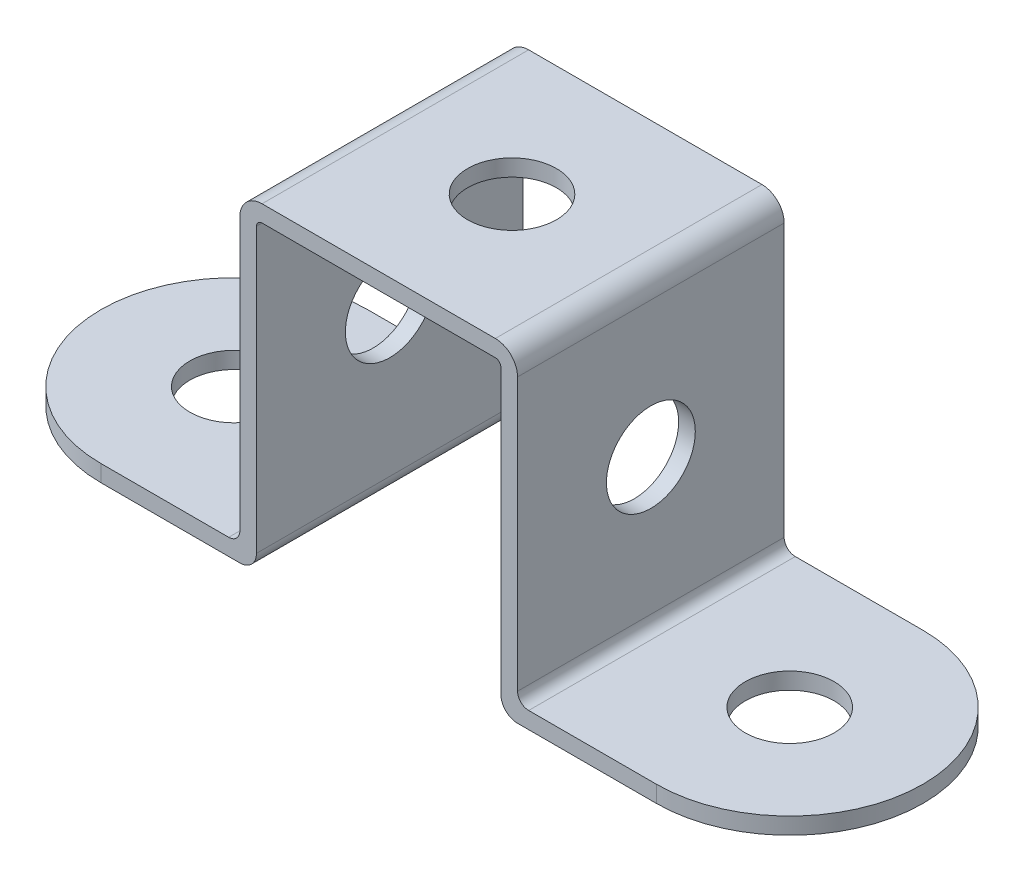
ISO-10303-21;
HEADER;
FILE_DESCRIPTION(('STEP AP214'),'2;1');
FILE_NAME('part.step','',(''),(''),'','','');
FILE_SCHEMA(('AUTOMOTIVE_DESIGN { 1 0 10303 214 1 1 1 1 }'));
ENDSEC;
DATA;
#1=APPLICATION_CONTEXT('core data for automotive mechanical design processes');
#2=APPLICATION_PROTOCOL_DEFINITION('international standard','automotive_design',2000,#1);
#3=PRODUCT_CONTEXT('',#1,'mechanical');
#4=PRODUCT('Part','Part','',(#3));
#5=PRODUCT_RELATED_PRODUCT_CATEGORY('part','',(#4));
#6=PRODUCT_DEFINITION_FORMATION('','',#4);
#7=PRODUCT_DEFINITION_CONTEXT('part definition',#1,'design');
#8=PRODUCT_DEFINITION('design','',#6,#7);
#9=PRODUCT_DEFINITION_SHAPE('','',#8);
#10=(LENGTH_UNIT() NAMED_UNIT(*) SI_UNIT(.MILLI.,.METRE.));
#11=(NAMED_UNIT(*) PLANE_ANGLE_UNIT() SI_UNIT($,.RADIAN.));
#12=(NAMED_UNIT(*) SI_UNIT($,.STERADIAN.) SOLID_ANGLE_UNIT());
#13=UNCERTAINTY_MEASURE_WITH_UNIT(LENGTH_MEASURE(1.E-05),#10,'distance_accuracy_value','');
#14=(GEOMETRIC_REPRESENTATION_CONTEXT(3) GLOBAL_UNCERTAINTY_ASSIGNED_CONTEXT((#13)) GLOBAL_UNIT_ASSIGNED_CONTEXT((#10,
#11,#12)) REPRESENTATION_CONTEXT('',''));
#15=CARTESIAN_POINT('',(0.,0.,0.));
#16=DIRECTION('',(0.,0.,1.));
#17=DIRECTION('',(1.,0.,0.));
#18=AXIS2_PLACEMENT_3D('',#15,#16,#17);
#19=CARTESIAN_POINT('',(0.,0.75,6.));
#20=DIRECTION('',(0.,-1.,0.));
#21=DIRECTION('',(1.,0.,0.));
#22=AXIS2_PLACEMENT_3D('',#19,#20,#21);
#23=PLANE('',#22);
#24=DIRECTION('',(-1.,0.,0.));
#25=VECTOR('',#24,1.);
#26=CARTESIAN_POINT('',(0.,0.75,-6.));
#27=LINE('',#26,#25);
#28=CARTESIAN_POINT('',(-1.25,0.75,-6.));
#29=VERTEX_POINT('',#28);
#30=CARTESIAN_POINT('',(-7.,0.749999999999999,-6.));
#31=VERTEX_POINT('',#30);
#32=EDGE_CURVE('E371',#29,#31,#27,.T.);
#33=ORIENTED_EDGE('',*,*,#32,.T.);
#34=CARTESIAN_POINT('',(-7.,0.749999999999999,0.));
#35=DIRECTION('',(0.,1.,0.));
#36=DIRECTION('',(-1.,0.,0.));
#37=AXIS2_PLACEMENT_3D('',#34,#35,#36);
#38=CIRCLE('',#37,6.);
#39=CARTESIAN_POINT('',(-7.,0.749999999999999,6.));
#40=VERTEX_POINT('',#39);
#41=EDGE_CURVE('E348',#31,#40,#38,.T.);
#42=ORIENTED_EDGE('',*,*,#41,.T.);
#43=DIRECTION('',(-1.,0.,0.));
#44=VECTOR('',#43,1.);
#45=CARTESIAN_POINT('',(0.,0.75,6.));
#46=LINE('',#45,#44);
#47=CARTESIAN_POINT('',(-1.25,0.75,6.));
#48=VERTEX_POINT('',#47);
#49=EDGE_CURVE('E372',#48,#40,#46,.T.);
#50=ORIENTED_EDGE('',*,*,#49,.F.);
#51=DIRECTION('',(0.,0.,-1.));
#52=VECTOR('',#51,1.);
#53=CARTESIAN_POINT('',(-1.25,0.75,-6.));
#54=LINE('',#53,#52);
#55=EDGE_CURVE('E410',#48,#29,#54,.T.);
#56=ORIENTED_EDGE('',*,*,#55,.T.);
#57=EDGE_LOOP('',(#33,#42,#50,#56));
#58=FACE_BOUND('',#57,.T.);
#59=CARTESIAN_POINT('',(-7.,0.749999999999999,0.));
#60=DIRECTION('',(0.,1.,0.));
#61=DIRECTION('',(-1.,0.,0.));
#62=AXIS2_PLACEMENT_3D('',#59,#60,#61);
#63=CIRCLE('',#62,2.);
#64=CARTESIAN_POINT('',(-9.,0.749999999999999,0.));
#65=VERTEX_POINT('',#64);
#66=EDGE_CURVE('E352',#65,#65,#63,.T.);
#67=ORIENTED_EDGE('',*,*,#66,.F.);
#68=EDGE_LOOP('',(#67));
#69=FACE_BOUND('',#68,.T.);
#70=ADVANCED_FACE('F39',(#58,#69),#23,.F.);
#71=CARTESIAN_POINT('',(0.,0.,6.));
#72=DIRECTION('',(0.,-1.,0.));
#73=DIRECTION('',(1.,0.,0.));
#74=AXIS2_PLACEMENT_3D('',#71,#72,#73);
#75=PLANE('',#74);
#76=DIRECTION('',(-1.,0.,0.));
#77=VECTOR('',#76,1.);
#78=CARTESIAN_POINT('',(0.,0.,6.));
#79=LINE('',#78,#77);
#80=CARTESIAN_POINT('',(-0.75,0.,6.));
#81=VERTEX_POINT('',#80);
#82=CARTESIAN_POINT('',(-7.,0.,6.));
#83=VERTEX_POINT('',#82);
#84=EDGE_CURVE('E375',#81,#83,#79,.T.);
#85=ORIENTED_EDGE('',*,*,#84,.T.);
#86=CARTESIAN_POINT('',(-7.,0.,0.));
#87=DIRECTION('',(0.,-1.,0.));
#88=DIRECTION('',(1.,0.,0.));
#89=AXIS2_PLACEMENT_3D('',#86,#87,#88);
#90=CIRCLE('',#89,6.);
#91=CARTESIAN_POINT('',(-7.,0.,-6.));
#92=VERTEX_POINT('',#91);
#93=EDGE_CURVE('E347',#92,#83,#90,.F.);
#94=ORIENTED_EDGE('',*,*,#93,.F.);
#95=DIRECTION('',(-1.,0.,0.));
#96=VECTOR('',#95,1.);
#97=CARTESIAN_POINT('',(0.,0.,-6.));
#98=LINE('',#97,#96);
#99=CARTESIAN_POINT('',(-0.75,0.,-6.));
#100=VERTEX_POINT('',#99);
#101=EDGE_CURVE('E389',#100,#92,#98,.T.);
#102=ORIENTED_EDGE('',*,*,#101,.F.);
#103=DIRECTION('',(0.,0.,-1.));
#104=VECTOR('',#103,1.);
#105=CARTESIAN_POINT('',(-0.75,0.,6.));
#106=LINE('',#105,#104);
#107=EDGE_CURVE('E404',#100,#81,#106,.F.);
#108=ORIENTED_EDGE('',*,*,#107,.T.);
#109=EDGE_LOOP('',(#85,#94,#102,#108));
#110=FACE_BOUND('',#109,.T.);
#111=CARTESIAN_POINT('',(-7.,0.,0.));
#112=DIRECTION('',(0.,-1.,0.));
#113=DIRECTION('',(1.,0.,0.));
#114=AXIS2_PLACEMENT_3D('',#111,#112,#113);
#115=CIRCLE('',#114,2.);
#116=CARTESIAN_POINT('',(-5.,0.,0.));
#117=VERTEX_POINT('',#116);
#118=EDGE_CURVE('E367',#117,#117,#115,.F.);
#119=ORIENTED_EDGE('',*,*,#118,.T.);
#120=EDGE_LOOP('',(#119));
#121=FACE_BOUND('',#120,.T.);
#122=ADVANCED_FACE('F445',(#110,#121),#75,.T.);
#123=CARTESIAN_POINT('',(0.,13.,6.));
#124=DIRECTION('',(1.,0.,0.));
#125=DIRECTION('',(0.,0.,-1.));
#126=AXIS2_PLACEMENT_3D('',#123,#124,#125);
#127=PLANE('',#126);
#128=CARTESIAN_POINT('',(0.,7.375,0.));
#129=DIRECTION('',(1.,0.,0.));
#130=DIRECTION('',(0.,0.,-1.));
#131=AXIS2_PLACEMENT_3D('',#128,#129,#130);
#132=CIRCLE('',#131,2.);
#133=CARTESIAN_POINT('',(0.,7.375,-2.));
#134=VERTEX_POINT('',#133);
#135=EDGE_CURVE('E548',#134,#134,#132,.T.);
#136=ORIENTED_EDGE('',*,*,#135,.F.);
#137=EDGE_LOOP('',(#136));
#138=FACE_BOUND('',#137,.T.);
#139=DIRECTION('',(0.,0.,-1.));
#140=VECTOR('',#139,1.);
#141=CARTESIAN_POINT('',(0.,13.5,6.));
#142=LINE('',#141,#140);
#143=CARTESIAN_POINT('',(0.,13.5,6.));
#144=VERTEX_POINT('',#143);
#145=CARTESIAN_POINT('',(0.,13.5,-6.));
#146=VERTEX_POINT('',#145);
#147=EDGE_CURVE('E319',#144,#146,#142,.T.);
#148=ORIENTED_EDGE('',*,*,#147,.F.);
#149=DIRECTION('',(0.,-1.,0.));
#150=VECTOR('',#149,1.);
#151=CARTESIAN_POINT('',(0.,13.,6.));
#152=LINE('',#151,#150);
#153=CARTESIAN_POINT('',(0.,0.750000000000004,6.));
#154=VERTEX_POINT('',#153);
#155=EDGE_CURVE('E379',#144,#154,#152,.T.);
#156=ORIENTED_EDGE('',*,*,#155,.T.);
#157=DIRECTION('',(0.,0.,-1.));
#158=VECTOR('',#157,1.);
#159=CARTESIAN_POINT('',(0.,0.750000000000001,6.));
#160=LINE('',#159,#158);
#161=CARTESIAN_POINT('',(0.,0.750000000000004,-6.));
#162=VERTEX_POINT('',#161);
#163=EDGE_CURVE('E386',#154,#162,#160,.T.);
#164=ORIENTED_EDGE('',*,*,#163,.T.);
#165=DIRECTION('',(0.,-1.,0.));
#166=VECTOR('',#165,1.);
#167=CARTESIAN_POINT('',(0.,13.,-6.));
#168=LINE('',#167,#166);
#169=EDGE_CURVE('E392',#146,#162,#168,.T.);
#170=ORIENTED_EDGE('',*,*,#169,.F.);
#171=EDGE_LOOP('',(#148,#156,#164,#170));
#172=FACE_BOUND('',#171,.T.);
#173=ADVANCED_FACE('F451',(#138,#172),#127,.T.);
#174=CARTESIAN_POINT('',(-0.75,13.,6.));
#175=DIRECTION('',(1.,0.,0.));
#176=DIRECTION('',(0.,0.,-1.));
#177=AXIS2_PLACEMENT_3D('',#174,#175,#176);
#178=PLANE('',#177);
#179=CARTESIAN_POINT('',(-0.75,7.375,0.));
#180=DIRECTION('',(1.,0.,0.));
#181=DIRECTION('',(0.,0.,-1.));
#182=AXIS2_PLACEMENT_3D('',#179,#180,#181);
#183=CIRCLE('',#182,2.);
#184=CARTESIAN_POINT('',(-0.75,7.375,-2.));
#185=VERTEX_POINT('',#184);
#186=EDGE_CURVE('E542',#185,#185,#183,.T.);
#187=ORIENTED_EDGE('',*,*,#186,.T.);
#188=EDGE_LOOP('',(#187));
#189=FACE_BOUND('',#188,.T.);
#190=DIRECTION('',(0.,1.,0.));
#191=VECTOR('',#190,1.);
#192=CARTESIAN_POINT('',(-0.75,13.,-6.));
#193=LINE('',#192,#191);
#194=CARTESIAN_POINT('',(-0.750000000000001,13.5,-6.));
#195=VERTEX_POINT('',#194);
#196=CARTESIAN_POINT('',(-0.75,1.25,-6.));
#197=VERTEX_POINT('',#196);
#198=EDGE_CURVE('E376',#195,#197,#193,.F.);
#199=ORIENTED_EDGE('',*,*,#198,.T.);
#200=DIRECTION('',(0.,0.,-1.));
#201=VECTOR('',#200,1.);
#202=CARTESIAN_POINT('',(-0.75,1.25,6.));
#203=LINE('',#202,#201);
#204=CARTESIAN_POINT('',(-0.75,1.25,6.));
#205=VERTEX_POINT('',#204);
#206=EDGE_CURVE('E55',#197,#205,#203,.F.);
#207=ORIENTED_EDGE('',*,*,#206,.T.);
#208=DIRECTION('',(0.,1.,0.));
#209=VECTOR('',#208,1.);
#210=CARTESIAN_POINT('',(-0.75,13.,6.));
#211=LINE('',#210,#209);
#212=CARTESIAN_POINT('',(-0.750000000000001,13.5,6.));
#213=VERTEX_POINT('',#212);
#214=EDGE_CURVE('E383',#213,#205,#211,.F.);
#215=ORIENTED_EDGE('',*,*,#214,.F.);
#216=DIRECTION('',(0.,0.,-1.));
#217=VECTOR('',#216,1.);
#218=CARTESIAN_POINT('',(-0.750000000000001,13.5,6.));
#219=LINE('',#218,#217);
#220=EDGE_CURVE('E335',#213,#195,#219,.T.);
#221=ORIENTED_EDGE('',*,*,#220,.T.);
#222=EDGE_LOOP('',(#199,#207,#215,#221));
#223=FACE_BOUND('',#222,.T.);
#224=ADVANCED_FACE('F457',(#189,#223),#178,.F.);
#225=CARTESIAN_POINT('',(0.,0.,6.));
#226=DIRECTION('',(0.,0.,-1.));
#227=DIRECTION('',(-1.,0.,0.));
#228=AXIS2_PLACEMENT_3D('',#225,#226,#227);
#229=PLANE('',#228);
#230=ORIENTED_EDGE('',*,*,#49,.T.);
#231=DIRECTION('',(0.,1.,0.));
#232=VECTOR('',#231,1.);
#233=CARTESIAN_POINT('',(-7.,-14.9253350046155,6.));
#234=LINE('',#233,#232);
#235=EDGE_CURVE('E357',#83,#40,#234,.T.);
#236=ORIENTED_EDGE('',*,*,#235,.F.);
#237=ORIENTED_EDGE('',*,*,#84,.F.);
#238=CARTESIAN_POINT('',(-0.75,0.750000000000001,6.));
#239=DIRECTION('',(0.,0.,-1.));
#240=DIRECTION('',(-1.,0.,0.));
#241=AXIS2_PLACEMENT_3D('',#238,#239,#240);
#242=CIRCLE('',#241,0.75);
#243=EDGE_CURVE('E407',#81,#154,#242,.F.);
#244=ORIENTED_EDGE('',*,*,#243,.T.);
#245=ORIENTED_EDGE('',*,*,#155,.F.);
#246=CARTESIAN_POINT('',(0.25,13.5,6.));
#247=DIRECTION('',(0.,0.,-1.));
#248=DIRECTION('',(-1.,0.,0.));
#249=AXIS2_PLACEMENT_3D('',#246,#247,#248);
#250=CIRCLE('',#249,0.25);
#251=CARTESIAN_POINT('',(0.25,13.75,6.));
#252=VERTEX_POINT('',#251);
#253=EDGE_CURVE('E304',#144,#252,#250,.T.);
#254=ORIENTED_EDGE('',*,*,#253,.T.);
#255=DIRECTION('',(1.,0.,0.));
#256=VECTOR('',#255,1.);
#257=CARTESIAN_POINT('',(0.25,13.75,6.));
#258=LINE('',#257,#256);
#259=CARTESIAN_POINT('',(10.75,13.75,6.));
#260=VERTEX_POINT('',#259);
#261=EDGE_CURVE('E308',#252,#260,#258,.T.);
#262=ORIENTED_EDGE('',*,*,#261,.T.);
#263=CARTESIAN_POINT('',(10.75,13.5,6.));
#264=DIRECTION('',(0.,0.,1.));
#265=DIRECTION('',(1.,0.,0.));
#266=AXIS2_PLACEMENT_3D('',#263,#264,#265);
#267=CIRCLE('',#266,0.25);
#268=CARTESIAN_POINT('',(11.,13.5,6.));
#269=VERTEX_POINT('',#268);
#270=EDGE_CURVE('E274',#269,#260,#267,.T.);
#271=ORIENTED_EDGE('',*,*,#270,.F.);
#272=DIRECTION('',(0.,-1.,0.));
#273=VECTOR('',#272,1.);
#274=CARTESIAN_POINT('',(11.,13.,6.));
#275=LINE('',#274,#273);
#276=CARTESIAN_POINT('',(11.,0.750000000000004,6.));
#277=VERTEX_POINT('',#276);
#278=EDGE_CURVE('E241',#269,#277,#275,.T.);
#279=ORIENTED_EDGE('',*,*,#278,.T.);
#280=CARTESIAN_POINT('',(11.75,0.750000000000001,6.));
#281=DIRECTION('',(0.,0.,1.));
#282=DIRECTION('',(1.,0.,0.));
#283=AXIS2_PLACEMENT_3D('',#280,#281,#282);
#284=CIRCLE('',#283,0.75);
#285=CARTESIAN_POINT('',(11.75,0.,6.));
#286=VERTEX_POINT('',#285);
#287=EDGE_CURVE('E271',#286,#277,#284,.F.);
#288=ORIENTED_EDGE('',*,*,#287,.F.);
#289=DIRECTION('',(1.,0.,0.));
#290=VECTOR('',#289,1.);
#291=CARTESIAN_POINT('',(11.,0.,6.));
#292=LINE('',#291,#290);
#293=CARTESIAN_POINT('',(18.,0.,6.));
#294=VERTEX_POINT('',#293);
#295=EDGE_CURVE('E220',#286,#294,#292,.T.);
#296=ORIENTED_EDGE('',*,*,#295,.T.);
#297=DIRECTION('',(0.,1.,0.));
#298=VECTOR('',#297,1.);
#299=CARTESIAN_POINT('',(18.,-14.9253350046155,6.));
#300=LINE('',#299,#298);
#301=CARTESIAN_POINT('',(18.,0.749999999999999,6.));
#302=VERTEX_POINT('',#301);
#303=EDGE_CURVE('E268',#294,#302,#300,.T.);
#304=ORIENTED_EDGE('',*,*,#303,.T.);
#305=DIRECTION('',(1.,0.,0.));
#306=VECTOR('',#305,1.);
#307=CARTESIAN_POINT('',(11.,0.75,6.));
#308=LINE('',#307,#306);
#309=CARTESIAN_POINT('',(12.25,0.75,6.));
#310=VERTEX_POINT('',#309);
#311=EDGE_CURVE('E196',#310,#302,#308,.T.);
#312=ORIENTED_EDGE('',*,*,#311,.F.);
#313=CARTESIAN_POINT('',(12.25,1.25,6.));
#314=DIRECTION('',(0.,0.,1.));
#315=DIRECTION('',(1.,0.,0.));
#316=AXIS2_PLACEMENT_3D('',#313,#314,#315);
#317=CIRCLE('',#316,0.5);
#318=CARTESIAN_POINT('',(11.75,1.25,6.));
#319=VERTEX_POINT('',#318);
#320=EDGE_CURVE('E187',#319,#310,#317,.T.);
#321=ORIENTED_EDGE('',*,*,#320,.F.);
#322=DIRECTION('',(0.,1.,0.));
#323=VECTOR('',#322,1.);
#324=CARTESIAN_POINT('',(11.75,13.,6.));
#325=LINE('',#324,#323);
#326=CARTESIAN_POINT('',(11.75,13.5,6.));
#327=VERTEX_POINT('',#326);
#328=EDGE_CURVE('E260',#327,#319,#325,.F.);
#329=ORIENTED_EDGE('',*,*,#328,.F.);
#330=CARTESIAN_POINT('',(10.75,13.5,6.));
#331=DIRECTION('',(0.,0.,-1.));
#332=DIRECTION('',(-1.,0.,0.));
#333=AXIS2_PLACEMENT_3D('',#330,#331,#332);
#334=CIRCLE('',#333,1.);
#335=CARTESIAN_POINT('',(10.75,14.5,6.));
#336=VERTEX_POINT('',#335);
#337=EDGE_CURVE('E278',#336,#327,#334,.T.);
#338=ORIENTED_EDGE('',*,*,#337,.F.);
#339=DIRECTION('',(-1.,0.,0.));
#340=VECTOR('',#339,1.);
#341=CARTESIAN_POINT('',(0.25,14.5,6.));
#342=LINE('',#341,#340);
#343=CARTESIAN_POINT('',(0.25,14.5,6.));
#344=VERTEX_POINT('',#343);
#345=EDGE_CURVE('E312',#336,#344,#342,.T.);
#346=ORIENTED_EDGE('',*,*,#345,.T.);
#347=CARTESIAN_POINT('',(0.25,13.5,6.));
#348=DIRECTION('',(0.,0.,1.));
#349=DIRECTION('',(1.,0.,0.));
#350=AXIS2_PLACEMENT_3D('',#347,#348,#349);
#351=CIRCLE('',#350,1.);
#352=EDGE_CURVE('E315',#344,#213,#351,.T.);
#353=ORIENTED_EDGE('',*,*,#352,.T.);
#354=ORIENTED_EDGE('',*,*,#214,.T.);
#355=CARTESIAN_POINT('',(-1.25,1.25,6.));
#356=DIRECTION('',(0.,0.,-1.));
#357=DIRECTION('',(-1.,0.,0.));
#358=AXIS2_PLACEMENT_3D('',#355,#356,#357);
#359=CIRCLE('',#358,0.5);
#360=EDGE_CURVE('E11',#205,#48,#359,.T.);
#361=ORIENTED_EDGE('',*,*,#360,.T.);
#362=EDGE_LOOP('',(#230,#236,#237,#244,#245,#254,#262,#271,#279,#288,#296,#304,#312,#321,#329,
#338,#346,#353,#354,#361));
#363=FACE_BOUND('',#362,.T.);
#364=ADVANCED_FACE('F431',(#363),#229,.F.);
#365=CARTESIAN_POINT('',(0.,0.,-6.));
#366=DIRECTION('',(0.,0.,-1.));
#367=DIRECTION('',(-1.,0.,0.));
#368=AXIS2_PLACEMENT_3D('',#365,#366,#367);
#369=PLANE('',#368);
#370=ORIENTED_EDGE('',*,*,#101,.T.);
#371=DIRECTION('',(0.,1.,0.));
#372=VECTOR('',#371,1.);
#373=CARTESIAN_POINT('',(-7.,-14.9253350046155,-6.));
#374=LINE('',#373,#372);
#375=EDGE_CURVE('E353',#92,#31,#374,.T.);
#376=ORIENTED_EDGE('',*,*,#375,.T.);
#377=ORIENTED_EDGE('',*,*,#32,.F.);
#378=CARTESIAN_POINT('',(-1.25,1.25,-6.));
#379=DIRECTION('',(0.,0.,-1.));
#380=DIRECTION('',(-1.,0.,0.));
#381=AXIS2_PLACEMENT_3D('',#378,#379,#380);
#382=CIRCLE('',#381,0.5);
#383=EDGE_CURVE('E48',#29,#197,#382,.F.);
#384=ORIENTED_EDGE('',*,*,#383,.T.);
#385=ORIENTED_EDGE('',*,*,#198,.F.);
#386=CARTESIAN_POINT('',(0.25,13.5,-6.));
#387=DIRECTION('',(0.,0.,1.));
#388=DIRECTION('',(1.,0.,0.));
#389=AXIS2_PLACEMENT_3D('',#386,#387,#388);
#390=CIRCLE('',#389,1.);
#391=CARTESIAN_POINT('',(0.25,14.5,-6.));
#392=VERTEX_POINT('',#391);
#393=EDGE_CURVE('E309',#392,#195,#390,.T.);
#394=ORIENTED_EDGE('',*,*,#393,.F.);
#395=DIRECTION('',(-1.,0.,0.));
#396=VECTOR('',#395,1.);
#397=CARTESIAN_POINT('',(0.25,14.5,-6.));
#398=LINE('',#397,#396);
#399=CARTESIAN_POINT('',(10.75,14.5,-6.));
#400=VERTEX_POINT('',#399);
#401=EDGE_CURVE('E326',#400,#392,#398,.T.);
#402=ORIENTED_EDGE('',*,*,#401,.F.);
#403=CARTESIAN_POINT('',(10.75,13.5,-6.));
#404=DIRECTION('',(0.,0.,-1.));
#405=DIRECTION('',(-1.,0.,0.));
#406=AXIS2_PLACEMENT_3D('',#403,#404,#405);
#407=CIRCLE('',#406,1.);
#408=CARTESIAN_POINT('',(11.75,13.5,-6.));
#409=VERTEX_POINT('',#408);
#410=EDGE_CURVE('E285',#400,#409,#407,.T.);
#411=ORIENTED_EDGE('',*,*,#410,.T.);
#412=DIRECTION('',(0.,1.,0.));
#413=VECTOR('',#412,1.);
#414=CARTESIAN_POINT('',(11.75,13.,-6.));
#415=LINE('',#414,#413);
#416=CARTESIAN_POINT('',(11.75,1.25,-6.));
#417=VERTEX_POINT('',#416);
#418=EDGE_CURVE('E253',#409,#417,#415,.F.);
#419=ORIENTED_EDGE('',*,*,#418,.T.);
#420=CARTESIAN_POINT('',(12.25,1.25,-6.));
#421=DIRECTION('',(0.,0.,1.));
#422=DIRECTION('',(1.,0.,0.));
#423=AXIS2_PLACEMENT_3D('',#420,#421,#422);
#424=CIRCLE('',#423,0.5);
#425=CARTESIAN_POINT('',(12.25,0.75,-6.));
#426=VERTEX_POINT('',#425);
#427=EDGE_CURVE('E186',#426,#417,#424,.F.);
#428=ORIENTED_EDGE('',*,*,#427,.F.);
#429=DIRECTION('',(1.,0.,0.));
#430=VECTOR('',#429,1.);
#431=CARTESIAN_POINT('',(11.,0.75,-6.));
#432=LINE('',#431,#430);
#433=CARTESIAN_POINT('',(18.,0.749999999999999,-6.));
#434=VERTEX_POINT('',#433);
#435=EDGE_CURVE('E194',#426,#434,#432,.T.);
#436=ORIENTED_EDGE('',*,*,#435,.T.);
#437=DIRECTION('',(0.,1.,0.));
#438=VECTOR('',#437,1.);
#439=CARTESIAN_POINT('',(18.,-14.9253350046155,-6.));
#440=LINE('',#439,#438);
#441=CARTESIAN_POINT('',(18.,0.,-6.));
#442=VERTEX_POINT('',#441);
#443=EDGE_CURVE('E175',#442,#434,#440,.T.);
#444=ORIENTED_EDGE('',*,*,#443,.F.);
#445=DIRECTION('',(1.,0.,0.));
#446=VECTOR('',#445,1.);
#447=CARTESIAN_POINT('',(11.,0.,-6.));
#448=LINE('',#447,#446);
#449=CARTESIAN_POINT('',(11.75,0.,-6.));
#450=VERTEX_POINT('',#449);
#451=EDGE_CURVE('E226',#450,#442,#448,.T.);
#452=ORIENTED_EDGE('',*,*,#451,.F.);
#453=CARTESIAN_POINT('',(11.75,0.750000000000001,-6.));
#454=DIRECTION('',(0.,0.,1.));
#455=DIRECTION('',(1.,0.,0.));
#456=AXIS2_PLACEMENT_3D('',#453,#454,#455);
#457=CIRCLE('',#456,0.75);
#458=CARTESIAN_POINT('',(11.,0.750000000000004,-6.));
#459=VERTEX_POINT('',#458);
#460=EDGE_CURVE('E292',#459,#450,#457,.T.);
#461=ORIENTED_EDGE('',*,*,#460,.F.);
#462=DIRECTION('',(0.,-1.,0.));
#463=VECTOR('',#462,1.);
#464=CARTESIAN_POINT('',(11.,13.,-6.));
#465=LINE('',#464,#463);
#466=CARTESIAN_POINT('',(11.,13.5,-6.));
#467=VERTEX_POINT('',#466);
#468=EDGE_CURVE('E249',#467,#459,#465,.T.);
#469=ORIENTED_EDGE('',*,*,#468,.F.);
#470=CARTESIAN_POINT('',(10.75,13.5,-6.));
#471=DIRECTION('',(0.,0.,1.));
#472=DIRECTION('',(1.,0.,0.));
#473=AXIS2_PLACEMENT_3D('',#470,#471,#472);
#474=CIRCLE('',#473,0.25);
#475=CARTESIAN_POINT('',(10.75,13.75,-6.));
#476=VERTEX_POINT('',#475);
#477=EDGE_CURVE('E288',#467,#476,#474,.T.);
#478=ORIENTED_EDGE('',*,*,#477,.T.);
#479=DIRECTION('',(1.,0.,0.));
#480=VECTOR('',#479,1.);
#481=CARTESIAN_POINT('',(0.25,13.75,-6.));
#482=LINE('',#481,#480);
#483=CARTESIAN_POINT('',(0.25,13.75,-6.));
#484=VERTEX_POINT('',#483);
#485=EDGE_CURVE('E323',#484,#476,#482,.T.);
#486=ORIENTED_EDGE('',*,*,#485,.F.);
#487=CARTESIAN_POINT('',(0.25,13.5,-6.));
#488=DIRECTION('',(0.,0.,-1.));
#489=DIRECTION('',(-1.,0.,0.));
#490=AXIS2_PLACEMENT_3D('',#487,#488,#489);
#491=CIRCLE('',#490,0.25);
#492=EDGE_CURVE('E303',#146,#484,#491,.T.);
#493=ORIENTED_EDGE('',*,*,#492,.F.);
#494=ORIENTED_EDGE('',*,*,#169,.T.);
#495=CARTESIAN_POINT('',(-0.75,0.750000000000001,-6.));
#496=DIRECTION('',(0.,0.,-1.));
#497=DIRECTION('',(-1.,0.,0.));
#498=AXIS2_PLACEMENT_3D('',#495,#496,#497);
#499=CIRCLE('',#498,0.75);
#500=EDGE_CURVE('E401',#162,#100,#499,.T.);
#501=ORIENTED_EDGE('',*,*,#500,.T.);
#502=EDGE_LOOP('',(#370,#376,#377,#384,#385,#394,#402,#411,#419,#428,#436,#444,#452,#461,#469,
#478,#486,#493,#494,#501));
#503=FACE_BOUND('',#502,.T.);
#504=ADVANCED_FACE('F199',(#503),#369,.T.);
#505=CARTESIAN_POINT('',(-7.,-5.65685424949238,0.));
#506=DIRECTION('',(0.,1.,0.));
#507=DIRECTION('',(-1.,0.,0.));
#508=AXIS2_PLACEMENT_3D('',#505,#506,#507);
#509=CYLINDRICAL_SURFACE('',#508,2.);
#510=ORIENTED_EDGE('',*,*,#66,.T.);
#511=EDGE_LOOP('',(#510));
#512=FACE_BOUND('',#511,.T.);
#513=ORIENTED_EDGE('',*,*,#118,.F.);
#514=EDGE_LOOP('',(#513));
#515=FACE_BOUND('',#514,.T.);
#516=ADVANCED_FACE('F442',(#512,#515),#509,.F.);
#517=CARTESIAN_POINT('',(-0.75,0.750000000000001,6.));
#518=DIRECTION('',(0.,0.,-1.));
#519=DIRECTION('',(-1.,0.,0.));
#520=AXIS2_PLACEMENT_3D('',#517,#518,#519);
#521=CYLINDRICAL_SURFACE('',#520,0.75);
#522=ORIENTED_EDGE('',*,*,#243,.F.);
#523=ORIENTED_EDGE('',*,*,#107,.F.);
#524=ORIENTED_EDGE('',*,*,#500,.F.);
#525=ORIENTED_EDGE('',*,*,#163,.F.);
#526=EDGE_LOOP('',(#522,#523,#524,#525));
#527=FACE_BOUND('',#526,.T.);
#528=ADVANCED_FACE('F434',(#527),#521,.T.);
#529=CARTESIAN_POINT('',(-1.25,1.25,6.));
#530=DIRECTION('',(0.,0.,1.));
#531=DIRECTION('',(1.,0.,0.));
#532=AXIS2_PLACEMENT_3D('',#529,#530,#531);
#533=CYLINDRICAL_SURFACE('',#532,0.5);
#534=ORIENTED_EDGE('',*,*,#360,.F.);
#535=ORIENTED_EDGE('',*,*,#206,.F.);
#536=ORIENTED_EDGE('',*,*,#383,.F.);
#537=ORIENTED_EDGE('',*,*,#55,.F.);
#538=EDGE_LOOP('',(#534,#535,#536,#537));
#539=FACE_BOUND('',#538,.T.);
#540=ADVANCED_FACE('F41',(#539),#533,.F.);
#541=CARTESIAN_POINT('',(-7.,-14.9253350046155,0.));
#542=DIRECTION('',(0.,1.,0.));
#543=DIRECTION('',(-1.,0.,0.));
#544=AXIS2_PLACEMENT_3D('',#541,#542,#543);
#545=CYLINDRICAL_SURFACE('',#544,6.);
#546=ORIENTED_EDGE('',*,*,#375,.F.);
#547=ORIENTED_EDGE('',*,*,#93,.T.);
#548=ORIENTED_EDGE('',*,*,#235,.T.);
#549=ORIENTED_EDGE('',*,*,#41,.F.);
#550=EDGE_LOOP('',(#546,#547,#548,#549));
#551=FACE_BOUND('',#550,.T.);
#552=ADVANCED_FACE('F427',(#551),#545,.T.);
#553=CARTESIAN_POINT('',(0.25,13.5,6.));
#554=DIRECTION('',(0.,0.,-1.));
#555=DIRECTION('',(-1.,0.,0.));
#556=AXIS2_PLACEMENT_3D('',#553,#554,#555);
#557=CYLINDRICAL_SURFACE('',#556,0.25);
#558=ORIENTED_EDGE('',*,*,#492,.T.);
#559=DIRECTION('',(0.,0.,-1.));
#560=VECTOR('',#559,1.);
#561=CARTESIAN_POINT('',(0.25,13.75,6.));
#562=LINE('',#561,#560);
#563=EDGE_CURVE('E343',#252,#484,#562,.T.);
#564=ORIENTED_EDGE('',*,*,#563,.F.);
#565=ORIENTED_EDGE('',*,*,#253,.F.);
#566=ORIENTED_EDGE('',*,*,#147,.T.);
#567=EDGE_LOOP('',(#558,#564,#565,#566));
#568=FACE_BOUND('',#567,.T.);
#569=ADVANCED_FACE('F440',(#568),#557,.F.);
#570=CARTESIAN_POINT('',(0.25,13.75,6.));
#571=DIRECTION('',(0.,1.,0.));
#572=DIRECTION('',(0.,0.,1.));
#573=AXIS2_PLACEMENT_3D('',#570,#571,#572);
#574=PLANE('',#573);
#575=CARTESIAN_POINT('',(5.5,13.75,0.));
#576=DIRECTION('',(0.,1.,0.));
#577=DIRECTION('',(0.,0.,1.));
#578=AXIS2_PLACEMENT_3D('',#575,#576,#577);
#579=CIRCLE('',#578,2.);
#580=CARTESIAN_POINT('',(5.5,13.75,2.));
#581=VERTEX_POINT('',#580);
#582=EDGE_CURVE('E203',#581,#581,#579,.F.);
#583=ORIENTED_EDGE('',*,*,#582,.F.);
#584=EDGE_LOOP('',(#583));
#585=FACE_BOUND('',#584,.T.);
#586=ORIENTED_EDGE('',*,*,#485,.T.);
#587=DIRECTION('',(0.,0.,-1.));
#588=VECTOR('',#587,1.);
#589=CARTESIAN_POINT('',(10.75,13.75,6.));
#590=LINE('',#589,#588);
#591=EDGE_CURVE('E295',#260,#476,#590,.T.);
#592=ORIENTED_EDGE('',*,*,#591,.F.);
#593=ORIENTED_EDGE('',*,*,#261,.F.);
#594=ORIENTED_EDGE('',*,*,#563,.T.);
#595=EDGE_LOOP('',(#586,#592,#593,#594));
#596=FACE_BOUND('',#595,.T.);
#597=ADVANCED_FACE('F471',(#585,#596),#574,.F.);
#598=CARTESIAN_POINT('',(0.25,14.5,6.));
#599=DIRECTION('',(0.,-1.,0.));
#600=DIRECTION('',(0.,0.,-1.));
#601=AXIS2_PLACEMENT_3D('',#598,#599,#600);
#602=PLANE('',#601);
#603=CARTESIAN_POINT('',(5.5,14.5,0.));
#604=DIRECTION('',(0.,1.,0.));
#605=DIRECTION('',(0.,0.,1.));
#606=AXIS2_PLACEMENT_3D('',#603,#604,#605);
#607=CIRCLE('',#606,2.);
#608=CARTESIAN_POINT('',(5.5,14.5,2.));
#609=VERTEX_POINT('',#608);
#610=EDGE_CURVE('E207',#609,#609,#607,.T.);
#611=ORIENTED_EDGE('',*,*,#610,.F.);
#612=EDGE_LOOP('',(#611));
#613=FACE_BOUND('',#612,.T.);
#614=ORIENTED_EDGE('',*,*,#401,.T.);
#615=DIRECTION('',(0.,0.,-1.));
#616=VECTOR('',#615,1.);
#617=CARTESIAN_POINT('',(0.25,14.5,6.));
#618=LINE('',#617,#616);
#619=EDGE_CURVE('E339',#344,#392,#618,.T.);
#620=ORIENTED_EDGE('',*,*,#619,.F.);
#621=ORIENTED_EDGE('',*,*,#345,.F.);
#622=DIRECTION('',(0.,0.,-1.));
#623=VECTOR('',#622,1.);
#624=CARTESIAN_POINT('',(10.75,14.5,6.));
#625=LINE('',#624,#623);
#626=EDGE_CURVE('E299',#336,#400,#625,.T.);
#627=ORIENTED_EDGE('',*,*,#626,.T.);
#628=EDGE_LOOP('',(#614,#620,#621,#627));
#629=FACE_BOUND('',#628,.T.);
#630=ADVANCED_FACE('F475',(#613,#629),#602,.F.);
#631=CARTESIAN_POINT('',(0.25,13.5,6.));
#632=DIRECTION('',(0.,0.,-1.));
#633=DIRECTION('',(-1.,0.,0.));
#634=AXIS2_PLACEMENT_3D('',#631,#632,#633);
#635=CYLINDRICAL_SURFACE('',#634,1.);
#636=ORIENTED_EDGE('',*,*,#393,.T.);
#637=ORIENTED_EDGE('',*,*,#220,.F.);
#638=ORIENTED_EDGE('',*,*,#352,.F.);
#639=ORIENTED_EDGE('',*,*,#619,.T.);
#640=EDGE_LOOP('',(#636,#637,#638,#639));
#641=FACE_BOUND('',#640,.T.);
#642=ADVANCED_FACE('F479',(#641),#635,.T.);
#643=CARTESIAN_POINT('',(11.,0.75,6.));
#644=DIRECTION('',(0.,-1.,0.));
#645=DIRECTION('',(-1.,0.,0.));
#646=AXIS2_PLACEMENT_3D('',#643,#644,#645);
#647=PLANE('',#646);
#648=ORIENTED_EDGE('',*,*,#435,.F.);
#649=DIRECTION('',(0.,0.,-1.));
#650=VECTOR('',#649,1.);
#651=CARTESIAN_POINT('',(12.25,0.75,-6.));
#652=LINE('',#651,#650);
#653=EDGE_CURVE('E213',#310,#426,#652,.T.);
#654=ORIENTED_EDGE('',*,*,#653,.F.);
#655=ORIENTED_EDGE('',*,*,#311,.T.);
#656=CARTESIAN_POINT('',(18.,0.749999999999999,0.));
#657=DIRECTION('',(0.,-1.,0.));
#658=DIRECTION('',(1.,0.,0.));
#659=AXIS2_PLACEMENT_3D('',#656,#657,#658);
#660=CIRCLE('',#659,6.);
#661=EDGE_CURVE('E178',#434,#302,#660,.T.);
#662=ORIENTED_EDGE('',*,*,#661,.F.);
#663=EDGE_LOOP('',(#648,#654,#655,#662));
#664=FACE_BOUND('',#663,.T.);
#665=CARTESIAN_POINT('',(18.,0.749999999999999,0.));
#666=DIRECTION('',(0.,-1.,0.));
#667=DIRECTION('',(1.,0.,0.));
#668=AXIS2_PLACEMENT_3D('',#665,#666,#667);
#669=CIRCLE('',#668,2.);
#670=CARTESIAN_POINT('',(20.,0.749999999999999,0.));
#671=VERTEX_POINT('',#670);
#672=EDGE_CURVE('E216',#671,#671,#669,.T.);
#673=ORIENTED_EDGE('',*,*,#672,.T.);
#674=EDGE_LOOP('',(#673));
#675=FACE_BOUND('',#674,.T.);
#676=ADVANCED_FACE('F191',(#664,#675),#647,.F.);
#677=CARTESIAN_POINT('',(11.,0.,6.));
#678=DIRECTION('',(0.,-1.,0.));
#679=DIRECTION('',(-1.,0.,0.));
#680=AXIS2_PLACEMENT_3D('',#677,#678,#679);
#681=PLANE('',#680);
#682=ORIENTED_EDGE('',*,*,#295,.F.);
#683=DIRECTION('',(0.,0.,-1.));
#684=VECTOR('',#683,1.);
#685=CARTESIAN_POINT('',(11.75,0.,6.));
#686=LINE('',#685,#684);
#687=EDGE_CURVE('E229',#450,#286,#686,.F.);
#688=ORIENTED_EDGE('',*,*,#687,.F.);
#689=ORIENTED_EDGE('',*,*,#451,.T.);
#690=CARTESIAN_POINT('',(18.,0.,0.));
#691=DIRECTION('',(0.,1.,0.));
#692=DIRECTION('',(-1.,0.,0.));
#693=AXIS2_PLACEMENT_3D('',#690,#691,#692);
#694=CIRCLE('',#693,6.);
#695=EDGE_CURVE('E181',#442,#294,#694,.F.);
#696=ORIENTED_EDGE('',*,*,#695,.T.);
#697=EDGE_LOOP('',(#682,#688,#689,#696));
#698=FACE_BOUND('',#697,.T.);
#699=CARTESIAN_POINT('',(18.,0.,0.));
#700=DIRECTION('',(0.,1.,0.));
#701=DIRECTION('',(-1.,0.,0.));
#702=AXIS2_PLACEMENT_3D('',#699,#700,#701);
#703=CIRCLE('',#702,2.);
#704=CARTESIAN_POINT('',(16.,0.,0.));
#705=VERTEX_POINT('',#704);
#706=EDGE_CURVE('E233',#705,#705,#703,.F.);
#707=ORIENTED_EDGE('',*,*,#706,.F.);
#708=EDGE_LOOP('',(#707));
#709=FACE_BOUND('',#708,.T.);
#710=ADVANCED_FACE('F514',(#698,#709),#681,.T.);
#711=CARTESIAN_POINT('',(11.,13.,6.));
#712=DIRECTION('',(-1.,0.,0.));
#713=DIRECTION('',(0.,0.,-1.));
#714=AXIS2_PLACEMENT_3D('',#711,#712,#713);
#715=PLANE('',#714);
#716=CARTESIAN_POINT('',(11.,7.375,0.));
#717=DIRECTION('',(-1.,0.,0.));
#718=DIRECTION('',(0.,0.,1.));
#719=AXIS2_PLACEMENT_3D('',#716,#717,#718);
#720=CIRCLE('',#719,2.);
#721=CARTESIAN_POINT('',(11.,7.375,2.));
#722=VERTEX_POINT('',#721);
#723=EDGE_CURVE('E535',#722,#722,#720,.T.);
#724=ORIENTED_EDGE('',*,*,#723,.F.);
#725=EDGE_LOOP('',(#724));
#726=FACE_BOUND('',#725,.T.);
#727=DIRECTION('',(0.,0.,-1.));
#728=VECTOR('',#727,1.);
#729=CARTESIAN_POINT('',(11.,13.5,6.));
#730=LINE('',#729,#728);
#731=EDGE_CURVE('E237',#269,#467,#730,.T.);
#732=ORIENTED_EDGE('',*,*,#731,.T.);
#733=ORIENTED_EDGE('',*,*,#468,.T.);
#734=DIRECTION('',(0.,0.,-1.));
#735=VECTOR('',#734,1.);
#736=CARTESIAN_POINT('',(11.,0.750000000000001,6.));
#737=LINE('',#736,#735);
#738=EDGE_CURVE('E245',#277,#459,#737,.T.);
#739=ORIENTED_EDGE('',*,*,#738,.F.);
#740=ORIENTED_EDGE('',*,*,#278,.F.);
#741=EDGE_LOOP('',(#732,#733,#739,#740));
#742=FACE_BOUND('',#741,.T.);
#743=ADVANCED_FACE('F510',(#726,#742),#715,.T.);
#744=CARTESIAN_POINT('',(11.75,13.,6.));
#745=DIRECTION('',(-1.,0.,0.));
#746=DIRECTION('',(0.,0.,-1.));
#747=AXIS2_PLACEMENT_3D('',#744,#745,#746);
#748=PLANE('',#747);
#749=CARTESIAN_POINT('',(11.75,7.375,0.));
#750=DIRECTION('',(1.,0.,0.));
#751=DIRECTION('',(0.,0.,-1.));
#752=AXIS2_PLACEMENT_3D('',#749,#750,#751);
#753=CIRCLE('',#752,2.);
#754=CARTESIAN_POINT('',(11.75,7.375,-2.));
#755=VERTEX_POINT('',#754);
#756=EDGE_CURVE('E538',#755,#755,#753,.T.);
#757=ORIENTED_EDGE('',*,*,#756,.F.);
#758=EDGE_LOOP('',(#757));
#759=FACE_BOUND('',#758,.T.);
#760=ORIENTED_EDGE('',*,*,#418,.F.);
#761=DIRECTION('',(0.,0.,-1.));
#762=VECTOR('',#761,1.);
#763=CARTESIAN_POINT('',(11.75,13.5,6.));
#764=LINE('',#763,#762);
#765=EDGE_CURVE('E264',#327,#409,#764,.T.);
#766=ORIENTED_EDGE('',*,*,#765,.F.);
#767=ORIENTED_EDGE('',*,*,#328,.T.);
#768=DIRECTION('',(0.,0.,-1.));
#769=VECTOR('',#768,1.);
#770=CARTESIAN_POINT('',(11.75,1.25,6.));
#771=LINE('',#770,#769);
#772=EDGE_CURVE('E256',#417,#319,#771,.F.);
#773=ORIENTED_EDGE('',*,*,#772,.F.);
#774=EDGE_LOOP('',(#760,#766,#767,#773));
#775=FACE_BOUND('',#774,.T.);
#776=ADVANCED_FACE('F506',(#759,#775),#748,.F.);
#777=CARTESIAN_POINT('',(18.,-5.65685424949238,0.));
#778=DIRECTION('',(0.,1.,0.));
#779=DIRECTION('',(1.,0.,0.));
#780=AXIS2_PLACEMENT_3D('',#777,#778,#779);
#781=CYLINDRICAL_SURFACE('',#780,2.);
#782=ORIENTED_EDGE('',*,*,#672,.F.);
#783=EDGE_LOOP('',(#782));
#784=FACE_BOUND('',#783,.T.);
#785=ORIENTED_EDGE('',*,*,#706,.T.);
#786=EDGE_LOOP('',(#785));
#787=FACE_BOUND('',#786,.T.);
#788=ADVANCED_FACE('F502',(#784,#787),#781,.F.);
#789=CARTESIAN_POINT('',(11.75,0.750000000000001,6.));
#790=DIRECTION('',(0.,0.,-1.));
#791=DIRECTION('',(1.,0.,0.));
#792=AXIS2_PLACEMENT_3D('',#789,#790,#791);
#793=CYLINDRICAL_SURFACE('',#792,0.75);
#794=ORIENTED_EDGE('',*,*,#287,.T.);
#795=ORIENTED_EDGE('',*,*,#738,.T.);
#796=ORIENTED_EDGE('',*,*,#460,.T.);
#797=ORIENTED_EDGE('',*,*,#687,.T.);
#798=EDGE_LOOP('',(#794,#795,#796,#797));
#799=FACE_BOUND('',#798,.T.);
#800=ADVANCED_FACE('F498',(#799),#793,.T.);
#801=CARTESIAN_POINT('',(12.25,1.25,6.));
#802=DIRECTION('',(0.,0.,1.));
#803=DIRECTION('',(-1.,0.,0.));
#804=AXIS2_PLACEMENT_3D('',#801,#802,#803);
#805=CYLINDRICAL_SURFACE('',#804,0.5);
#806=ORIENTED_EDGE('',*,*,#320,.T.);
#807=ORIENTED_EDGE('',*,*,#653,.T.);
#808=ORIENTED_EDGE('',*,*,#427,.T.);
#809=ORIENTED_EDGE('',*,*,#772,.T.);
#810=EDGE_LOOP('',(#806,#807,#808,#809));
#811=FACE_BOUND('',#810,.T.);
#812=ADVANCED_FACE('F495',(#811),#805,.F.);
#813=CARTESIAN_POINT('',(18.,-14.9253350046155,0.));
#814=DIRECTION('',(0.,1.,0.));
#815=DIRECTION('',(1.,0.,0.));
#816=AXIS2_PLACEMENT_3D('',#813,#814,#815);
#817=CYLINDRICAL_SURFACE('',#816,6.);
#818=ORIENTED_EDGE('',*,*,#443,.T.);
#819=ORIENTED_EDGE('',*,*,#661,.T.);
#820=ORIENTED_EDGE('',*,*,#303,.F.);
#821=ORIENTED_EDGE('',*,*,#695,.F.);
#822=EDGE_LOOP('',(#818,#819,#820,#821));
#823=FACE_BOUND('',#822,.T.);
#824=ADVANCED_FACE('F177',(#823),#817,.T.);
#825=CARTESIAN_POINT('',(10.75,13.5,6.));
#826=DIRECTION('',(0.,0.,-1.));
#827=DIRECTION('',(1.,0.,0.));
#828=AXIS2_PLACEMENT_3D('',#825,#826,#827);
#829=CYLINDRICAL_SURFACE('',#828,0.25);
#830=ORIENTED_EDGE('',*,*,#477,.F.);
#831=ORIENTED_EDGE('',*,*,#731,.F.);
#832=ORIENTED_EDGE('',*,*,#270,.T.);
#833=ORIENTED_EDGE('',*,*,#591,.T.);
#834=EDGE_LOOP('',(#830,#831,#832,#833));
#835=FACE_BOUND('',#834,.T.);
#836=ADVANCED_FACE('F488',(#835),#829,.F.);
#837=CARTESIAN_POINT('',(10.75,13.5,6.));
#838=DIRECTION('',(0.,0.,-1.));
#839=DIRECTION('',(1.,0.,0.));
#840=AXIS2_PLACEMENT_3D('',#837,#838,#839);
#841=CYLINDRICAL_SURFACE('',#840,1.);
#842=ORIENTED_EDGE('',*,*,#410,.F.);
#843=ORIENTED_EDGE('',*,*,#626,.F.);
#844=ORIENTED_EDGE('',*,*,#337,.T.);
#845=ORIENTED_EDGE('',*,*,#765,.T.);
#846=EDGE_LOOP('',(#842,#843,#844,#845));
#847=FACE_BOUND('',#846,.T.);
#848=ADVANCED_FACE('F484',(#847),#841,.T.);
#849=CARTESIAN_POINT('',(5.5,8.09314575050761,0.));
#850=DIRECTION('',(0.,1.,0.));
#851=DIRECTION('',(0.,0.,1.));
#852=AXIS2_PLACEMENT_3D('',#849,#850,#851);
#853=CYLINDRICAL_SURFACE('',#852,2.);
#854=ORIENTED_EDGE('',*,*,#582,.T.);
#855=EDGE_LOOP('',(#854));
#856=FACE_BOUND('',#855,.T.);
#857=ORIENTED_EDGE('',*,*,#610,.T.);
#858=EDGE_LOOP('',(#857));
#859=FACE_BOUND('',#858,.T.);
#860=ADVANCED_FACE('F487',(#856,#859),#853,.F.);
#861=CARTESIAN_POINT('',(-7.25000000000001,7.375,0.));
#862=DIRECTION('',(1.,0.,0.));
#863=DIRECTION('',(0.,0.,-1.));
#864=AXIS2_PLACEMENT_3D('',#861,#862,#863);
#865=CYLINDRICAL_SURFACE('',#864,2.);
#866=ORIENTED_EDGE('',*,*,#723,.T.);
#867=EDGE_LOOP('',(#866));
#868=FACE_BOUND('',#867,.T.);
#869=ORIENTED_EDGE('',*,*,#756,.T.);
#870=EDGE_LOOP('',(#869));
#871=FACE_BOUND('',#870,.T.);
#872=ADVANCED_FACE('F523',(#868,#871),#865,.F.);
#873=ORIENTED_EDGE('',*,*,#135,.T.);
#874=EDGE_LOOP('',(#873));
#875=FACE_BOUND('',#874,.T.);
#876=ORIENTED_EDGE('',*,*,#186,.F.);
#877=EDGE_LOOP('',(#876));
#878=FACE_BOUND('',#877,.T.);
#879=ADVANCED_FACE('F526',(#875,#878),#865,.F.);
#880=CLOSED_SHELL('',(#70,#122,#173,#224,#364,#504,#516,#528,#540,#552,#569,#597,#630,#642,#676,
#710,#743,#776,#788,#800,#812,#824,#836,#848,#860,#872,#879));
#881=MANIFOLD_SOLID_BREP('B2',#880);
#882=ADVANCED_BREP_SHAPE_REPRESENTATION('',(#18,#881),#14);
#883=SHAPE_DEFINITION_REPRESENTATION(#9,#882);
ENDSEC;
END-ISO-10303-21;
